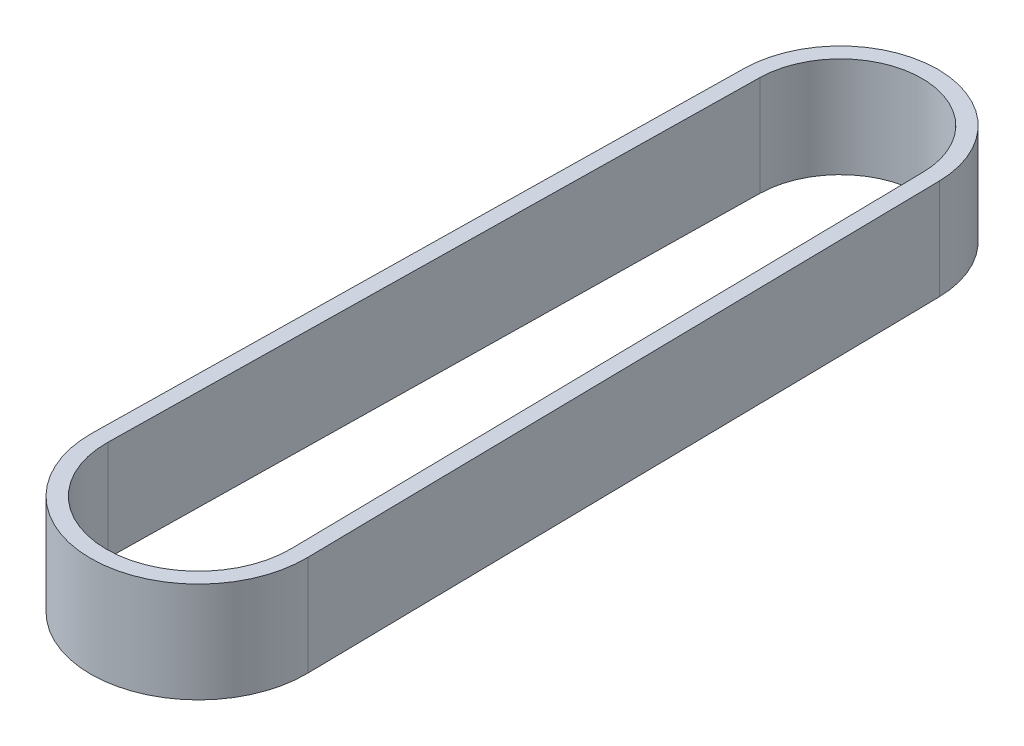
ISO-10303-21;
HEADER;
FILE_DESCRIPTION(('STEP AP214'),'2;1');
FILE_NAME('part.step','',(''),(''),'','','');
FILE_SCHEMA(('AUTOMOTIVE_DESIGN { 1 0 10303 214 1 1 1 1 }'));
ENDSEC;
DATA;
#1=APPLICATION_CONTEXT('core data for automotive mechanical design processes');
#2=APPLICATION_PROTOCOL_DEFINITION('international standard','automotive_design',2000,#1);
#3=PRODUCT_CONTEXT('',#1,'mechanical');
#4=PRODUCT('Part','Part','',(#3));
#5=PRODUCT_RELATED_PRODUCT_CATEGORY('part','',(#4));
#6=PRODUCT_DEFINITION_FORMATION('','',#4);
#7=PRODUCT_DEFINITION_CONTEXT('part definition',#1,'design');
#8=PRODUCT_DEFINITION('design','',#6,#7);
#9=PRODUCT_DEFINITION_SHAPE('','',#8);
#10=(LENGTH_UNIT() NAMED_UNIT(*) SI_UNIT(.MILLI.,.METRE.));
#11=(NAMED_UNIT(*) PLANE_ANGLE_UNIT() SI_UNIT($,.RADIAN.));
#12=(NAMED_UNIT(*) SI_UNIT($,.STERADIAN.) SOLID_ANGLE_UNIT());
#13=UNCERTAINTY_MEASURE_WITH_UNIT(LENGTH_MEASURE(1.E-05),#10,'distance_accuracy_value','');
#14=(GEOMETRIC_REPRESENTATION_CONTEXT(3) GLOBAL_UNCERTAINTY_ASSIGNED_CONTEXT((#13)) GLOBAL_UNIT_ASSIGNED_CONTEXT((#10,
#11,#12)) REPRESENTATION_CONTEXT('',''));
#15=CARTESIAN_POINT('',(0.,0.,0.));
#16=DIRECTION('',(0.,0.,1.));
#17=DIRECTION('',(1.,0.,0.));
#18=AXIS2_PLACEMENT_3D('',#15,#16,#17);
#19=CARTESIAN_POINT('',(0.,3.175,12.4999999999999));
#20=DIRECTION('',(0.,1.,0.));
#21=DIRECTION('',(0.,0.,1.));
#22=AXIS2_PLACEMENT_3D('',#19,#20,#21);
#23=PLANE('',#22);
#24=CARTESIAN_POINT('',(0.,3.175,12.4999999999999));
#25=DIRECTION('',(0.,1.,0.));
#26=DIRECTION('',(0.,0.,1.));
#27=AXIS2_PLACEMENT_3D('',#24,#25,#26);
#28=CIRCLE('',#27,6.82);
#29=CARTESIAN_POINT('',(-6.8191407924459,3.175,12.3917463497137));
#30=VERTEX_POINT('',#29);
#31=CARTESIAN_POINT('',(6.81914079244591,3.175,12.3917463497137));
#32=VERTEX_POINT('',#31);
#33=EDGE_CURVE('E146',#30,#32,#28,.T.);
#34=ORIENTED_EDGE('',*,*,#33,.T.);
#35=DIRECTION('',(-0.0158729692501734,0.,-0.999874016487669));
#36=VECTOR('',#35,1.);
#37=CARTESIAN_POINT('',(6.81914079244591,3.175,12.3917463497137));
#38=LINE('',#37,#36);
#39=CARTESIAN_POINT('',(6.17422205181136,3.175,-28.2331349401803));
#40=VERTEX_POINT('',#39);
#41=EDGE_CURVE('E149',#32,#40,#38,.T.);
#42=ORIENTED_EDGE('',*,*,#41,.T.);
#43=CARTESIAN_POINT('',(0.,3.175,-28.1351193550605));
#44=DIRECTION('',(0.,1.,0.));
#45=DIRECTION('',(0.,0.,1.));
#46=AXIS2_PLACEMENT_3D('',#43,#44,#45);
#47=CIRCLE('',#46,6.175);
#48=CARTESIAN_POINT('',(-6.17422205181136,3.175,-28.2331349401803));
#49=VERTEX_POINT('',#48);
#50=EDGE_CURVE('E152',#40,#49,#47,.T.);
#51=ORIENTED_EDGE('',*,*,#50,.T.);
#52=DIRECTION('',(-0.0158729692501734,0.,0.999874016487669));
#53=VECTOR('',#52,1.);
#54=CARTESIAN_POINT('',(-6.17422205181136,3.175,-28.2331349401803));
#55=LINE('',#54,#53);
#56=EDGE_CURVE('E154',#49,#30,#55,.T.);
#57=ORIENTED_EDGE('',*,*,#56,.T.);
#58=EDGE_LOOP('',(#34,#42,#51,#57));
#59=FACE_BOUND('',#58,.T.);
#60=DIRECTION('',(-0.0158729692501735,0.,-0.999874016487669));
#61=VECTOR('',#60,1.);
#62=CARTESIAN_POINT('',(5.81926677595824,3.175,12.4076193189639));
#63=LINE('',#62,#61);
#64=CARTESIAN_POINT('',(5.81926677595824,3.175,12.4076193189639));
#65=VERTEX_POINT('',#64);
#66=CARTESIAN_POINT('',(5.17434803532369,3.175,-28.2172619709301));
#67=VERTEX_POINT('',#66);
#68=EDGE_CURVE('E118',#65,#67,#63,.T.);
#69=ORIENTED_EDGE('',*,*,#68,.F.);
#70=CARTESIAN_POINT('',(0.,3.175,12.4999999999999));
#71=DIRECTION('',(0.,1.,0.));
#72=DIRECTION('',(0.,0.,1.));
#73=AXIS2_PLACEMENT_3D('',#70,#71,#72);
#74=CIRCLE('',#73,5.82);
#75=CARTESIAN_POINT('',(-5.81926677595823,3.175,12.4076193189639));
#76=VERTEX_POINT('',#75);
#77=EDGE_CURVE('E110',#76,#65,#74,.T.);
#78=ORIENTED_EDGE('',*,*,#77,.F.);
#79=DIRECTION('',(-0.0158729692501734,0.,0.999874016487669));
#80=VECTOR('',#79,1.);
#81=CARTESIAN_POINT('',(-5.17434803532369,3.175,-28.2172619709301));
#82=LINE('',#81,#80);
#83=CARTESIAN_POINT('',(-5.17434803532369,3.175,-28.2172619709301));
#84=VERTEX_POINT('',#83);
#85=EDGE_CURVE('E132',#84,#76,#82,.T.);
#86=ORIENTED_EDGE('',*,*,#85,.F.);
#87=CARTESIAN_POINT('',(0.,3.175,-28.1351193550605));
#88=DIRECTION('',(0.,1.,0.));
#89=DIRECTION('',(0.,0.,1.));
#90=AXIS2_PLACEMENT_3D('',#87,#88,#89);
#91=CIRCLE('',#90,5.175);
#92=EDGE_CURVE('E130',#67,#84,#91,.T.);
#93=ORIENTED_EDGE('',*,*,#92,.F.);
#94=EDGE_LOOP('',(#69,#78,#86,#93));
#95=FACE_BOUND('',#94,.T.);
#96=ADVANCED_FACE('F45',(#59,#95),#23,.T.);
#97=CARTESIAN_POINT('',(0.,-3.175,12.4999999999999));
#98=DIRECTION('',(0.,1.,0.));
#99=DIRECTION('',(0.,0.,1.));
#100=AXIS2_PLACEMENT_3D('',#97,#98,#99);
#101=PLANE('',#100);
#102=CARTESIAN_POINT('',(0.,-3.175,12.4999999999999));
#103=DIRECTION('',(0.,1.,0.));
#104=DIRECTION('',(0.,0.,1.));
#105=AXIS2_PLACEMENT_3D('',#102,#103,#104);
#106=CIRCLE('',#105,6.82);
#107=CARTESIAN_POINT('',(-6.8191407924459,-3.175,12.3917463497137));
#108=VERTEX_POINT('',#107);
#109=CARTESIAN_POINT('',(6.81914079244591,-3.175,12.3917463497137));
#110=VERTEX_POINT('',#109);
#111=EDGE_CURVE('E126',#108,#110,#106,.T.);
#112=ORIENTED_EDGE('',*,*,#111,.F.);
#113=DIRECTION('',(-0.0158729692501734,0.,0.999874016487669));
#114=VECTOR('',#113,1.);
#115=CARTESIAN_POINT('',(-6.17422205181136,-3.175,-28.2331349401803));
#116=LINE('',#115,#114);
#117=CARTESIAN_POINT('',(-6.17422205181136,-3.175,-28.2331349401803));
#118=VERTEX_POINT('',#117);
#119=EDGE_CURVE('E150',#118,#108,#116,.T.);
#120=ORIENTED_EDGE('',*,*,#119,.F.);
#121=CARTESIAN_POINT('',(0.,-3.175,-28.1351193550605));
#122=DIRECTION('',(0.,1.,0.));
#123=DIRECTION('',(0.,0.,1.));
#124=AXIS2_PLACEMENT_3D('',#121,#122,#123);
#125=CIRCLE('',#124,6.175);
#126=CARTESIAN_POINT('',(6.17422205181136,-3.175,-28.2331349401803));
#127=VERTEX_POINT('',#126);
#128=EDGE_CURVE('E161',#127,#118,#125,.T.);
#129=ORIENTED_EDGE('',*,*,#128,.F.);
#130=DIRECTION('',(-0.0158729692501734,0.,-0.999874016487669));
#131=VECTOR('',#130,1.);
#132=CARTESIAN_POINT('',(6.81914079244591,-3.175,12.3917463497137));
#133=LINE('',#132,#131);
#134=EDGE_CURVE('E159',#110,#127,#133,.T.);
#135=ORIENTED_EDGE('',*,*,#134,.F.);
#136=EDGE_LOOP('',(#112,#120,#129,#135));
#137=FACE_BOUND('',#136,.T.);
#138=CARTESIAN_POINT('',(0.,-3.175,12.4999999999999));
#139=DIRECTION('',(0.,1.,0.));
#140=DIRECTION('',(0.,0.,1.));
#141=AXIS2_PLACEMENT_3D('',#138,#139,#140);
#142=CIRCLE('',#141,5.82);
#143=CARTESIAN_POINT('',(-5.81926677595823,-3.175,12.4076193189639));
#144=VERTEX_POINT('',#143);
#145=CARTESIAN_POINT('',(5.81926677595824,-3.175,12.4076193189639));
#146=VERTEX_POINT('',#145);
#147=EDGE_CURVE('E68',#144,#146,#142,.T.);
#148=ORIENTED_EDGE('',*,*,#147,.T.);
#149=DIRECTION('',(-0.0158729692501735,0.,-0.999874016487669));
#150=VECTOR('',#149,1.);
#151=CARTESIAN_POINT('',(5.81926677595824,-3.175,12.4076193189639));
#152=LINE('',#151,#150);
#153=CARTESIAN_POINT('',(5.17434803532369,-3.175,-28.2172619709301));
#154=VERTEX_POINT('',#153);
#155=EDGE_CURVE('E125',#146,#154,#152,.T.);
#156=ORIENTED_EDGE('',*,*,#155,.T.);
#157=CARTESIAN_POINT('',(0.,-3.175,-28.1351193550605));
#158=DIRECTION('',(0.,1.,0.));
#159=DIRECTION('',(0.,0.,1.));
#160=AXIS2_PLACEMENT_3D('',#157,#158,#159);
#161=CIRCLE('',#160,5.175);
#162=CARTESIAN_POINT('',(-5.17434803532369,-3.175,-28.2172619709301));
#163=VERTEX_POINT('',#162);
#164=EDGE_CURVE('E138',#154,#163,#161,.T.);
#165=ORIENTED_EDGE('',*,*,#164,.T.);
#166=DIRECTION('',(-0.0158729692501734,0.,0.999874016487669));
#167=VECTOR('',#166,1.);
#168=CARTESIAN_POINT('',(-5.17434803532369,-3.175,-28.2172619709301));
#169=LINE('',#168,#167);
#170=EDGE_CURVE('E119',#163,#144,#169,.T.);
#171=ORIENTED_EDGE('',*,*,#170,.T.);
#172=EDGE_LOOP('',(#148,#156,#165,#171));
#173=FACE_BOUND('',#172,.T.);
#174=ADVANCED_FACE('F179',(#137,#173),#101,.F.);
#175=CARTESIAN_POINT('',(0.,3.175,12.4999999999999));
#176=DIRECTION('',(0.,-1.,0.));
#177=DIRECTION('',(0.,0.,-1.));
#178=AXIS2_PLACEMENT_3D('',#175,#176,#177);
#179=CYLINDRICAL_SURFACE('',#178,6.82);
#180=ORIENTED_EDGE('',*,*,#111,.T.);
#181=DIRECTION('',(0.,-1.,0.));
#182=VECTOR('',#181,1.);
#183=CARTESIAN_POINT('',(6.81914079244591,3.175,12.3917463497137));
#184=LINE('',#183,#182);
#185=EDGE_CURVE('E13',#32,#110,#184,.T.);
#186=ORIENTED_EDGE('',*,*,#185,.F.);
#187=ORIENTED_EDGE('',*,*,#33,.F.);
#188=DIRECTION('',(0.,-1.,0.));
#189=VECTOR('',#188,1.);
#190=CARTESIAN_POINT('',(-6.8191407924459,3.175,12.3917463497137));
#191=LINE('',#190,#189);
#192=EDGE_CURVE('E156',#30,#108,#191,.T.);
#193=ORIENTED_EDGE('',*,*,#192,.T.);
#194=EDGE_LOOP('',(#180,#186,#187,#193));
#195=FACE_BOUND('',#194,.T.);
#196=ADVANCED_FACE('F47',(#195),#179,.T.);
#197=CARTESIAN_POINT('',(6.81914079244591,3.175,12.3917463497137));
#198=DIRECTION('',(-0.999874016487669,0.,0.0158729692501734));
#199=DIRECTION('',(0.0158729692501734,0.,0.999874016487669));
#200=AXIS2_PLACEMENT_3D('',#197,#198,#199);
#201=PLANE('',#200);
#202=ORIENTED_EDGE('',*,*,#134,.T.);
#203=DIRECTION('',(0.,-1.,0.));
#204=VECTOR('',#203,1.);
#205=CARTESIAN_POINT('',(6.17422205181136,3.175,-28.2331349401803));
#206=LINE('',#205,#204);
#207=EDGE_CURVE('E53',#40,#127,#206,.T.);
#208=ORIENTED_EDGE('',*,*,#207,.F.);
#209=ORIENTED_EDGE('',*,*,#41,.F.);
#210=ORIENTED_EDGE('',*,*,#185,.T.);
#211=EDGE_LOOP('',(#202,#208,#209,#210));
#212=FACE_BOUND('',#211,.T.);
#213=ADVANCED_FACE('F189',(#212),#201,.F.);
#214=CARTESIAN_POINT('',(0.,3.175,-28.1351193550605));
#215=DIRECTION('',(0.,-1.,0.));
#216=DIRECTION('',(0.,0.,-1.));
#217=AXIS2_PLACEMENT_3D('',#214,#215,#216);
#218=CYLINDRICAL_SURFACE('',#217,6.175);
#219=ORIENTED_EDGE('',*,*,#128,.T.);
#220=DIRECTION('',(0.,-1.,0.));
#221=VECTOR('',#220,1.);
#222=CARTESIAN_POINT('',(-6.17422205181136,3.175,-28.2331349401803));
#223=LINE('',#222,#221);
#224=EDGE_CURVE('E166',#49,#118,#223,.T.);
#225=ORIENTED_EDGE('',*,*,#224,.F.);
#226=ORIENTED_EDGE('',*,*,#50,.F.);
#227=ORIENTED_EDGE('',*,*,#207,.T.);
#228=EDGE_LOOP('',(#219,#225,#226,#227));
#229=FACE_BOUND('',#228,.T.);
#230=ADVANCED_FACE('F173',(#229),#218,.T.);
#231=CARTESIAN_POINT('',(-6.17422205181136,3.175,-28.2331349401803));
#232=DIRECTION('',(0.999874016487669,0.,0.0158729692501734));
#233=DIRECTION('',(0.0158729692501734,0.,-0.999874016487669));
#234=AXIS2_PLACEMENT_3D('',#231,#232,#233);
#235=PLANE('',#234);
#236=ORIENTED_EDGE('',*,*,#119,.T.);
#237=ORIENTED_EDGE('',*,*,#192,.F.);
#238=ORIENTED_EDGE('',*,*,#56,.F.);
#239=ORIENTED_EDGE('',*,*,#224,.T.);
#240=EDGE_LOOP('',(#236,#237,#238,#239));
#241=FACE_BOUND('',#240,.T.);
#242=ADVANCED_FACE('F183',(#241),#235,.F.);
#243=CARTESIAN_POINT('',(0.,3.175,12.4999999999999));
#244=DIRECTION('',(0.,-1.,0.));
#245=DIRECTION('',(0.,0.,-1.));
#246=AXIS2_PLACEMENT_3D('',#243,#244,#245);
#247=CYLINDRICAL_SURFACE('',#246,5.82);
#248=ORIENTED_EDGE('',*,*,#147,.F.);
#249=DIRECTION('',(0.,-1.,0.));
#250=VECTOR('',#249,1.);
#251=CARTESIAN_POINT('',(-5.81926677595823,3.175,12.4076193189639));
#252=LINE('',#251,#250);
#253=EDGE_CURVE('E114',#76,#144,#252,.T.);
#254=ORIENTED_EDGE('',*,*,#253,.F.);
#255=ORIENTED_EDGE('',*,*,#77,.T.);
#256=DIRECTION('',(0.,-1.,0.));
#257=VECTOR('',#256,1.);
#258=CARTESIAN_POINT('',(5.81926677595824,3.175,12.4076193189639));
#259=LINE('',#258,#257);
#260=EDGE_CURVE('E113',#65,#146,#259,.T.);
#261=ORIENTED_EDGE('',*,*,#260,.T.);
#262=EDGE_LOOP('',(#248,#254,#255,#261));
#263=FACE_BOUND('',#262,.T.);
#264=ADVANCED_FACE('F112',(#263),#247,.F.);
#265=CARTESIAN_POINT('',(5.81926677595824,3.175,12.4076193189639));
#266=DIRECTION('',(-0.999874016487669,0.,0.0158729692501735));
#267=DIRECTION('',(0.0158729692501735,0.,0.999874016487669));
#268=AXIS2_PLACEMENT_3D('',#265,#266,#267);
#269=PLANE('',#268);
#270=ORIENTED_EDGE('',*,*,#155,.F.);
#271=ORIENTED_EDGE('',*,*,#260,.F.);
#272=ORIENTED_EDGE('',*,*,#68,.T.);
#273=DIRECTION('',(0.,-1.,0.));
#274=VECTOR('',#273,1.);
#275=CARTESIAN_POINT('',(5.17434803532369,3.175,-28.2172619709301));
#276=LINE('',#275,#274);
#277=EDGE_CURVE('E127',#67,#154,#276,.T.);
#278=ORIENTED_EDGE('',*,*,#277,.T.);
#279=EDGE_LOOP('',(#270,#271,#272,#278));
#280=FACE_BOUND('',#279,.T.);
#281=ADVANCED_FACE('F122',(#280),#269,.T.);
#282=CARTESIAN_POINT('',(0.,3.175,-28.1351193550605));
#283=DIRECTION('',(0.,-1.,0.));
#284=DIRECTION('',(0.,0.,-1.));
#285=AXIS2_PLACEMENT_3D('',#282,#283,#284);
#286=CYLINDRICAL_SURFACE('',#285,5.175);
#287=ORIENTED_EDGE('',*,*,#164,.F.);
#288=ORIENTED_EDGE('',*,*,#277,.F.);
#289=ORIENTED_EDGE('',*,*,#92,.T.);
#290=DIRECTION('',(0.,-1.,0.));
#291=VECTOR('',#290,1.);
#292=CARTESIAN_POINT('',(-5.17434803532369,3.175,-28.2172619709301));
#293=LINE('',#292,#291);
#294=EDGE_CURVE('E60',#84,#163,#293,.T.);
#295=ORIENTED_EDGE('',*,*,#294,.T.);
#296=EDGE_LOOP('',(#287,#288,#289,#295));
#297=FACE_BOUND('',#296,.T.);
#298=ADVANCED_FACE('F212',(#297),#286,.F.);
#299=CARTESIAN_POINT('',(-5.17434803532369,3.175,-28.2172619709301));
#300=DIRECTION('',(0.999874016487669,0.,0.0158729692501734));
#301=DIRECTION('',(0.0158729692501734,0.,-0.999874016487669));
#302=AXIS2_PLACEMENT_3D('',#299,#300,#301);
#303=PLANE('',#302);
#304=ORIENTED_EDGE('',*,*,#170,.F.);
#305=ORIENTED_EDGE('',*,*,#294,.F.);
#306=ORIENTED_EDGE('',*,*,#85,.T.);
#307=ORIENTED_EDGE('',*,*,#253,.T.);
#308=EDGE_LOOP('',(#304,#305,#306,#307));
#309=FACE_BOUND('',#308,.T.);
#310=ADVANCED_FACE('F216',(#309),#303,.T.);
#311=CLOSED_SHELL('',(#96,#174,#196,#213,#230,#242,#264,#281,#298,#310));
#312=MANIFOLD_SOLID_BREP('B2',#311);
#313=ADVANCED_BREP_SHAPE_REPRESENTATION('',(#18,#312),#14);
#314=SHAPE_DEFINITION_REPRESENTATION(#9,#313);
ENDSEC;
END-ISO-10303-21;
